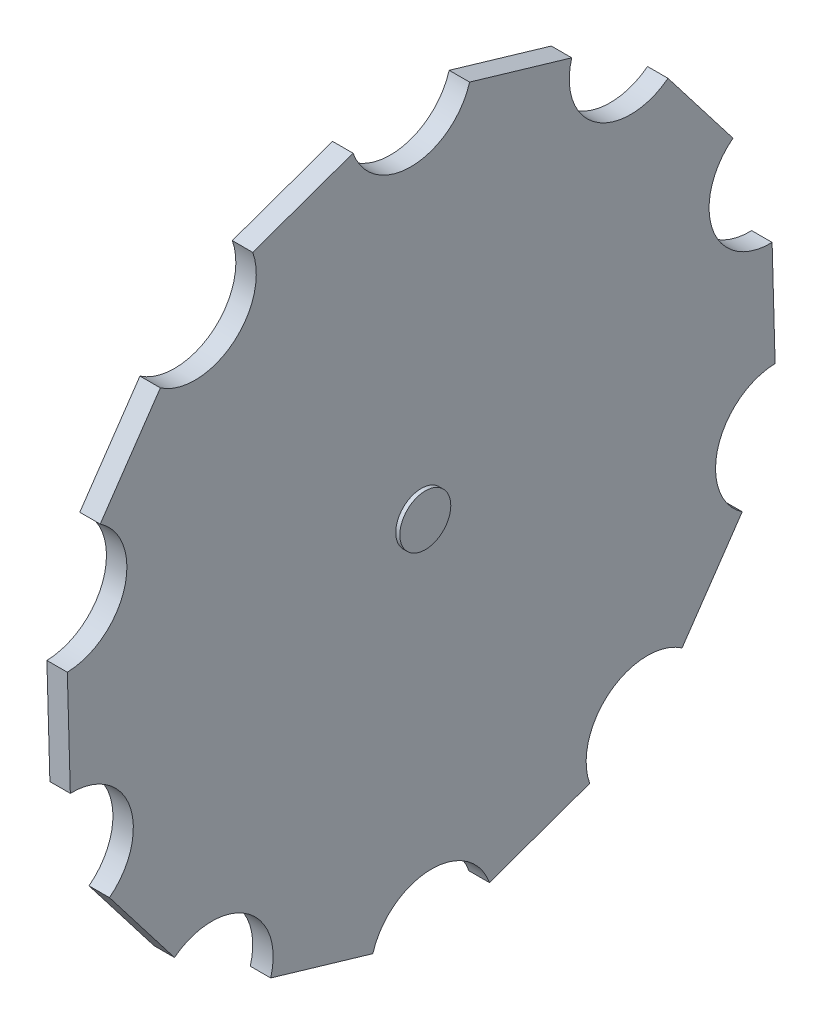
ISO-10303-21;
HEADER;
FILE_DESCRIPTION(('STEP AP214'),'2;1');
FILE_NAME('part.step','',(''),(''),'','','');
FILE_SCHEMA(('AUTOMOTIVE_DESIGN { 1 0 10303 214 1 1 1 1 }'));
ENDSEC;
DATA;
#1=APPLICATION_CONTEXT('core data for automotive mechanical design processes');
#2=APPLICATION_PROTOCOL_DEFINITION('international standard','automotive_design',2000,#1);
#3=PRODUCT_CONTEXT('',#1,'mechanical');
#4=PRODUCT('Part','Part','',(#3));
#5=PRODUCT_RELATED_PRODUCT_CATEGORY('part','',(#4));
#6=PRODUCT_DEFINITION_FORMATION('','',#4);
#7=PRODUCT_DEFINITION_CONTEXT('part definition',#1,'design');
#8=PRODUCT_DEFINITION('design','',#6,#7);
#9=PRODUCT_DEFINITION_SHAPE('','',#8);
#10=(LENGTH_UNIT() NAMED_UNIT(*) SI_UNIT(.MILLI.,.METRE.));
#11=(NAMED_UNIT(*) PLANE_ANGLE_UNIT() SI_UNIT($,.RADIAN.));
#12=(NAMED_UNIT(*) SI_UNIT($,.STERADIAN.) SOLID_ANGLE_UNIT());
#13=UNCERTAINTY_MEASURE_WITH_UNIT(LENGTH_MEASURE(1.E-05),#10,'distance_accuracy_value','');
#14=(GEOMETRIC_REPRESENTATION_CONTEXT(3) GLOBAL_UNCERTAINTY_ASSIGNED_CONTEXT((#13)) GLOBAL_UNIT_ASSIGNED_CONTEXT((#10,
#11,#12)) REPRESENTATION_CONTEXT('',''));
#15=CARTESIAN_POINT('',(0.,0.,0.));
#16=DIRECTION('',(0.,0.,1.));
#17=DIRECTION('',(1.,0.,0.));
#18=AXIS2_PLACEMENT_3D('',#15,#16,#17);
#19=CARTESIAN_POINT('',(5.,71.8468122282782,55.356705303896));
#20=DIRECTION('',(-1.,0.,0.));
#21=DIRECTION('',(0.,0.,1.));
#22=AXIS2_PLACEMENT_3D('',#19,#20,#21);
#23=CYLINDRICAL_SURFACE('',#22,14.9999999999995);
#24=CARTESIAN_POINT('',(0.,71.8468122282782,55.356705303896));
#25=DIRECTION('',(-1.,0.,0.));
#26=DIRECTION('',(0.,0.,-1.));
#27=AXIS2_PLACEMENT_3D('',#24,#25,#26);
#28=CIRCLE('',#27,14.9999999999995);
#29=CARTESIAN_POINT('',(0.,76.881944553864,41.2270399694369));
#30=VERTEX_POINT('',#29);
#31=CARTESIAN_POINT('',(0.,59.4680957045261,63.8282681599802));
#32=VERTEX_POINT('',#31);
#33=EDGE_CURVE('E244',#30,#32,#28,.T.);
#34=ORIENTED_EDGE('',*,*,#33,.T.);
#35=DIRECTION('',(-1.,0.,0.));
#36=VECTOR('',#35,1.);
#37=CARTESIAN_POINT('',(5.,59.4680957045261,63.8282681599802));
#38=LINE('',#37,#36);
#39=CARTESIAN_POINT('',(5.,59.4680957045261,63.8282681599802));
#40=VERTEX_POINT('',#39);
#41=EDGE_CURVE('E11',#40,#32,#38,.T.);
#42=ORIENTED_EDGE('',*,*,#41,.F.);
#43=CARTESIAN_POINT('',(5.,71.8468122282782,55.356705303896));
#44=DIRECTION('',(-1.,0.,0.));
#45=DIRECTION('',(0.,0.,-1.));
#46=AXIS2_PLACEMENT_3D('',#43,#44,#45);
#47=CIRCLE('',#46,14.9999999999995);
#48=CARTESIAN_POINT('',(5.,76.881944553864,41.2270399694369));
#49=VERTEX_POINT('',#48);
#50=EDGE_CURVE('E300',#49,#40,#47,.T.);
#51=ORIENTED_EDGE('',*,*,#50,.F.);
#52=DIRECTION('',(-1.,0.,0.));
#53=VECTOR('',#52,1.);
#54=CARTESIAN_POINT('',(5.,76.881944553864,41.2270399694369));
#55=LINE('',#54,#53);
#56=EDGE_CURVE('E240',#49,#30,#55,.T.);
#57=ORIENTED_EDGE('',*,*,#56,.T.);
#58=EDGE_LOOP('',(#34,#42,#51,#57));
#59=FACE_BOUND('',#58,.T.);
#60=ADVANCED_FACE('F47',(#59),#23,.F.);
#61=CARTESIAN_POINT('',(5.,59.4680957045261,63.8282681599802));
#62=DIRECTION('',(0.,-0.564770857072383,-0.825247768250073));
#63=DIRECTION('',(0.,0.825247768250073,-0.564770857072384));
#64=AXIS2_PLACEMENT_3D('',#61,#62,#63);
#65=PLANE('',#64);
#66=DIRECTION('',(0.,-0.825247768250073,0.564770857072383));
#67=VECTOR('',#66,1.);
#68=CARTESIAN_POINT('',(0.,59.4680957045261,63.8282681599802));
#69=LINE('',#68,#67);
#70=CARTESIAN_POINT('',(0.,37.9661536149617,78.5434491393781));
#71=VERTEX_POINT('',#70);
#72=EDGE_CURVE('E248',#32,#71,#69,.T.);
#73=ORIENTED_EDGE('',*,*,#72,.T.);
#74=DIRECTION('',(-1.,0.,0.));
#75=VECTOR('',#74,1.);
#76=CARTESIAN_POINT('',(5.,37.9661536149617,78.5434491393781));
#77=LINE('',#76,#75);
#78=CARTESIAN_POINT('',(5.,37.9661536149617,78.5434491393781));
#79=VERTEX_POINT('',#78);
#80=EDGE_CURVE('E55',#79,#71,#77,.T.);
#81=ORIENTED_EDGE('',*,*,#80,.F.);
#82=DIRECTION('',(0.,-0.825247768250073,0.564770857072383));
#83=VECTOR('',#82,1.);
#84=CARTESIAN_POINT('',(5.,59.4680957045261,63.8282681599802));
#85=LINE('',#84,#83);
#86=EDGE_CURVE('E157',#40,#79,#85,.T.);
#87=ORIENTED_EDGE('',*,*,#86,.F.);
#88=ORIENTED_EDGE('',*,*,#41,.T.);
#89=EDGE_LOOP('',(#73,#81,#87,#88));
#90=FACE_BOUND('',#89,.T.);
#91=ADVANCED_FACE('F442',(#90),#65,.F.);
#92=CARTESIAN_POINT('',(5.,25.5874370912123,87.0150119954661));
#93=DIRECTION('',(-1.,0.,0.));
#94=DIRECTION('',(0.,0.,1.));
#95=AXIS2_PLACEMENT_3D('',#92,#93,#94);
#96=CYLINDRICAL_SURFACE('',#95,14.9999999999999);
#97=CARTESIAN_POINT('',(0.,25.5874370912123,87.0150119954661));
#98=DIRECTION('',(-1.,0.,0.));
#99=DIRECTION('',(0.,0.,-1.));
#100=AXIS2_PLACEMENT_3D('',#97,#98,#99);
#101=CIRCLE('',#100,14.9999999999999);
#102=CARTESIAN_POINT('',(0.,10.5933853442723,86.5926232999832));
#103=VERTEX_POINT('',#102);
#104=EDGE_CURVE('E252',#71,#103,#101,.T.);
#105=ORIENTED_EDGE('',*,*,#104,.T.);
#106=DIRECTION('',(-1.,0.,0.));
#107=VECTOR('',#106,1.);
#108=CARTESIAN_POINT('',(5.,10.5933853442723,86.5926232999832));
#109=LINE('',#108,#107);
#110=CARTESIAN_POINT('',(5.,10.5933853442723,86.5926232999832));
#111=VERTEX_POINT('',#110);
#112=EDGE_CURVE('E353',#111,#103,#109,.T.);
#113=ORIENTED_EDGE('',*,*,#112,.F.);
#114=CARTESIAN_POINT('',(5.,25.5874370912123,87.0150119954661));
#115=DIRECTION('',(-1.,0.,0.));
#116=DIRECTION('',(0.,0.,-1.));
#117=AXIS2_PLACEMENT_3D('',#114,#115,#116);
#118=CIRCLE('',#117,14.9999999999999);
#119=EDGE_CURVE('E364',#79,#111,#118,.T.);
#120=ORIENTED_EDGE('',*,*,#119,.F.);
#121=ORIENTED_EDGE('',*,*,#80,.T.);
#122=EDGE_LOOP('',(#105,#113,#120,#121));
#123=FACE_BOUND('',#122,.T.);
#124=ADVANCED_FACE('F362',(#123),#96,.F.);
#125=CARTESIAN_POINT('',(5.,10.5933853442723,86.5926232999832));
#126=DIRECTION('',(0.,0.0281592463654012,-0.999603449796034));
#127=DIRECTION('',(0.,0.999603449796034,0.0281592463654012));
#128=AXIS2_PLACEMENT_3D('',#125,#126,#127);
#129=PLANE('',#128);
#130=DIRECTION('',(0.,-0.999603449796034,-0.0281592463654012));
#131=VECTOR('',#130,1.);
#132=CARTESIAN_POINT('',(0.,10.5933853442723,86.5926232999832));
#133=LINE('',#132,#131);
#134=CARTESIAN_POINT('',(0.,-15.4514175827556,85.8589303317265));
#135=VERTEX_POINT('',#134);
#136=EDGE_CURVE('E255',#103,#135,#133,.T.);
#137=ORIENTED_EDGE('',*,*,#136,.T.);
#138=DIRECTION('',(-1.,0.,0.));
#139=VECTOR('',#138,1.);
#140=CARTESIAN_POINT('',(5.,-15.4514175827556,85.8589303317265));
#141=LINE('',#140,#139);
#142=CARTESIAN_POINT('',(5.,-15.4514175827556,85.8589303317265));
#143=VERTEX_POINT('',#142);
#144=EDGE_CURVE('E349',#143,#135,#141,.T.);
#145=ORIENTED_EDGE('',*,*,#144,.F.);
#146=DIRECTION('',(0.,-0.999603449796034,-0.0281592463654012));
#147=VECTOR('',#146,1.);
#148=CARTESIAN_POINT('',(5.,10.5933853442723,86.5926232999832));
#149=LINE('',#148,#147);
#150=EDGE_CURVE('E383',#111,#143,#149,.T.);
#151=ORIENTED_EDGE('',*,*,#150,.F.);
#152=ORIENTED_EDGE('',*,*,#112,.T.);
#153=EDGE_LOOP('',(#137,#145,#151,#152));
#154=FACE_BOUND('',#153,.T.);
#155=ADVANCED_FACE('F373',(#154),#129,.F.);
#156=CARTESIAN_POINT('',(5.,-30.445469329697,85.436541636248));
#157=DIRECTION('',(-1.,0.,0.));
#158=DIRECTION('',(0.,0.,1.));
#159=AXIS2_PLACEMENT_3D('',#156,#157,#158);
#160=CYLINDRICAL_SURFACE('',#159,15.0000000000007);
#161=CARTESIAN_POINT('',(0.,-30.445469329697,85.436541636248));
#162=DIRECTION('',(-1.,0.,0.));
#163=DIRECTION('',(0.,0.,-1.));
#164=AXIS2_PLACEMENT_3D('',#161,#162,#163);
#165=CIRCLE('',#164,15.0000000000007);
#166=CARTESIAN_POINT('',(0.,-42.3276381615703,76.2815395144077));
#167=VERTEX_POINT('',#166);
#168=EDGE_CURVE('E258',#135,#167,#165,.T.);
#169=ORIENTED_EDGE('',*,*,#168,.T.);
#170=DIRECTION('',(-1.,0.,0.));
#171=VECTOR('',#170,1.);
#172=CARTESIAN_POINT('',(5.,-42.3276381615703,76.2815395144077));
#173=LINE('',#172,#171);
#174=CARTESIAN_POINT('',(5.,-42.3276381615703,76.2815395144077));
#175=VERTEX_POINT('',#174);
#176=EDGE_CURVE('E345',#175,#167,#173,.T.);
#177=ORIENTED_EDGE('',*,*,#176,.F.);
#178=CARTESIAN_POINT('',(5.,-30.445469329697,85.436541636248));
#179=DIRECTION('',(-1.,0.,0.));
#180=DIRECTION('',(0.,0.,-1.));
#181=AXIS2_PLACEMENT_3D('',#178,#179,#180);
#182=CIRCLE('',#181,15.0000000000007);
#183=EDGE_CURVE('E379',#143,#175,#182,.T.);
#184=ORIENTED_EDGE('',*,*,#183,.F.);
#185=ORIENTED_EDGE('',*,*,#144,.T.);
#186=EDGE_LOOP('',(#169,#177,#184,#185));
#187=FACE_BOUND('',#186,.T.);
#188=ADVANCED_FACE('F377',(#187),#160,.F.);
#189=CARTESIAN_POINT('',(5.,-42.3276381615703,76.2815395144077));
#190=DIRECTION('',(0.,0.610333474789187,-0.792144588791564));
#191=DIRECTION('',(0.,0.792144588791564,0.610333474789187));
#192=AXIS2_PLACEMENT_3D('',#189,#190,#191);
#193=PLANE('',#192);
#194=DIRECTION('',(0.,-0.792144588791564,-0.610333474789187));
#195=VECTOR('',#194,1.);
#196=CARTESIAN_POINT('',(0.,-42.3276381615703,76.2815395144077));
#197=LINE('',#196,#195);
#198=CARTESIAN_POINT('',(0.,-62.9670724382288,60.379218375065));
#199=VERTEX_POINT('',#198);
#200=EDGE_CURVE('E261',#167,#199,#197,.T.);
#201=ORIENTED_EDGE('',*,*,#200,.T.);
#202=DIRECTION('',(-1.,0.,0.));
#203=VECTOR('',#202,1.);
#204=CARTESIAN_POINT('',(5.,-62.9670724382288,60.379218375065));
#205=LINE('',#204,#203);
#206=CARTESIAN_POINT('',(5.,-62.9670724382288,60.379218375065));
#207=VERTEX_POINT('',#206);
#208=EDGE_CURVE('E341',#207,#199,#205,.T.);
#209=ORIENTED_EDGE('',*,*,#208,.F.);
#210=DIRECTION('',(0.,-0.792144588791564,-0.610333474789187));
#211=VECTOR('',#210,1.);
#212=CARTESIAN_POINT('',(5.,-42.3276381615703,76.2815395144077));
#213=LINE('',#212,#211);
#214=EDGE_CURVE('E382',#175,#207,#213,.T.);
#215=ORIENTED_EDGE('',*,*,#214,.F.);
#216=ORIENTED_EDGE('',*,*,#176,.T.);
#217=EDGE_LOOP('',(#201,#209,#215,#216));
#218=FACE_BOUND('',#217,.T.);
#219=ADVANCED_FACE('F455',(#218),#193,.F.);
#220=CARTESIAN_POINT('',(5.,-74.8492412701045,51.2242162532287));
#221=DIRECTION('',(-1.,0.,0.));
#222=DIRECTION('',(0.,0.,1.));
#223=AXIS2_PLACEMENT_3D('',#220,#221,#222);
#224=CYLINDRICAL_SURFACE('',#223,15.0000000000007);
#225=CARTESIAN_POINT('',(0.,-74.8492412701045,51.2242162532287));
#226=DIRECTION('',(-1.,0.,0.));
#227=DIRECTION('',(0.,0.,-1.));
#228=AXIS2_PLACEMENT_3D('',#225,#226,#227);
#229=CIRCLE('',#228,15.0000000000007);
#230=CARTESIAN_POINT('',(0.,-79.0809425531984,36.8335003484966));
#231=VERTEX_POINT('',#230);
#232=EDGE_CURVE('E264',#199,#231,#229,.T.);
#233=ORIENTED_EDGE('',*,*,#232,.T.);
#234=DIRECTION('',(-1.,0.,0.));
#235=VECTOR('',#234,1.);
#236=CARTESIAN_POINT('',(5.,-79.0809425531984,36.8335003484966));
#237=LINE('',#236,#235);
#238=CARTESIAN_POINT('',(5.,-79.0809425531984,36.8335003484966));
#239=VERTEX_POINT('',#238);
#240=EDGE_CURVE('E338',#239,#231,#237,.T.);
#241=ORIENTED_EDGE('',*,*,#240,.F.);
#242=CARTESIAN_POINT('',(5.,-74.8492412701045,51.2242162532287));
#243=DIRECTION('',(-1.,0.,0.));
#244=DIRECTION('',(0.,0.,-1.));
#245=AXIS2_PLACEMENT_3D('',#242,#243,#244);
#246=CIRCLE('',#245,15.0000000000007);
#247=EDGE_CURVE('E386',#207,#239,#246,.T.);
#248=ORIENTED_EDGE('',*,*,#247,.F.);
#249=ORIENTED_EDGE('',*,*,#208,.T.);
#250=EDGE_LOOP('',(#233,#241,#248,#249));
#251=FACE_BOUND('',#250,.T.);
#252=ADVANCED_FACE('F458',(#251),#224,.F.);
#253=CARTESIAN_POINT('',(5.,-79.0809425531984,36.8335003484966));
#254=DIRECTION('',(0.,0.959381060315333,-0.282113418873025));
#255=DIRECTION('',(0.,0.282113418873025,0.959381060315333));
#256=AXIS2_PLACEMENT_3D('',#253,#254,#255);
#257=PLANE('',#256);
#258=DIRECTION('',(0.,-0.282113418873025,-0.959381060315333));
#259=VECTOR('',#258,1.);
#260=CARTESIAN_POINT('',(0.,-79.0809425531984,36.8335003484966));
#261=LINE('',#260,#259);
#262=CARTESIAN_POINT('',(0.,-86.4314457943753,11.8366972132809));
#263=VERTEX_POINT('',#262);
#264=EDGE_CURVE('E267',#231,#263,#261,.T.);
#265=ORIENTED_EDGE('',*,*,#264,.T.);
#266=DIRECTION('',(-1.,0.,0.));
#267=VECTOR('',#266,1.);
#268=CARTESIAN_POINT('',(5.,-86.4314457943753,11.8366972132809));
#269=LINE('',#268,#267);
#270=CARTESIAN_POINT('',(5.,-86.4314457943753,11.8366972132809));
#271=VERTEX_POINT('',#270);
#272=EDGE_CURVE('E334',#271,#263,#269,.T.);
#273=ORIENTED_EDGE('',*,*,#272,.F.);
#274=DIRECTION('',(0.,-0.282113418873025,-0.959381060315333));
#275=VECTOR('',#274,1.);
#276=CARTESIAN_POINT('',(5.,-79.0809425531984,36.8335003484966));
#277=LINE('',#276,#275);
#278=EDGE_CURVE('E394',#239,#271,#277,.T.);
#279=ORIENTED_EDGE('',*,*,#278,.F.);
#280=ORIENTED_EDGE('',*,*,#240,.T.);
#281=EDGE_LOOP('',(#265,#273,#279,#280));
#282=FACE_BOUND('',#281,.T.);
#283=ADVANCED_FACE('F462',(#282),#257,.F.);
#284=CARTESIAN_POINT('',(5.,-90.6631470774734,-2.55401869144907));
#285=DIRECTION('',(-1.,0.,0.));
#286=DIRECTION('',(0.,0.,1.));
#287=AXIS2_PLACEMENT_3D('',#284,#285,#286);
#288=CYLINDRICAL_SURFACE('',#287,15.0000000000007);
#289=CARTESIAN_POINT('',(0.,-90.6631470774734,-2.55401869144907));
#290=DIRECTION('',(-1.,0.,0.));
#291=DIRECTION('',(0.,0.,-1.));
#292=AXIS2_PLACEMENT_3D('',#289,#290,#291);
#293=CIRCLE('',#292,15.0000000000007);
#294=CARTESIAN_POINT('',(0.,-85.6280147518824,-16.6836840259091));
#295=VERTEX_POINT('',#294);
#296=EDGE_CURVE('E270',#263,#295,#293,.T.);
#297=ORIENTED_EDGE('',*,*,#296,.T.);
#298=DIRECTION('',(-1.,0.,0.));
#299=VECTOR('',#298,1.);
#300=CARTESIAN_POINT('',(5.,-85.6280147518824,-16.6836840259091));
#301=LINE('',#300,#299);
#302=CARTESIAN_POINT('',(5.,-85.6280147518824,-16.6836840259091));
#303=VERTEX_POINT('',#302);
#304=EDGE_CURVE('E330',#303,#295,#301,.T.);
#305=ORIENTED_EDGE('',*,*,#304,.F.);
#306=CARTESIAN_POINT('',(5.,-90.6631470774734,-2.55401869144907));
#307=DIRECTION('',(-1.,0.,0.));
#308=DIRECTION('',(0.,0.,-1.));
#309=AXIS2_PLACEMENT_3D('',#306,#307,#308);
#310=CIRCLE('',#309,15.0000000000007);
#311=EDGE_CURVE('E397',#271,#303,#310,.T.);
#312=ORIENTED_EDGE('',*,*,#311,.F.);
#313=ORIENTED_EDGE('',*,*,#272,.T.);
#314=EDGE_LOOP('',(#297,#305,#312,#313));
#315=FACE_BOUND('',#314,.T.);
#316=ADVANCED_FACE('F465',(#315),#288,.F.);
#317=CARTESIAN_POINT('',(5.,-85.6280147518824,-16.6836840259091));
#318=DIRECTION('',(0.,0.941977688963934,0.335675488372574));
#319=DIRECTION('',(0.,-0.335675488372575,0.941977688963934));
#320=AXIS2_PLACEMENT_3D('',#317,#318,#319);
#321=PLANE('',#320);
#322=DIRECTION('',(0.,0.335675488372574,-0.941977688963934));
#323=VECTOR('',#322,1.);
#324=CARTESIAN_POINT('',(0.,-85.6280147518824,-16.6836840259091));
#325=LINE('',#324,#323);
#326=CARTESIAN_POINT('',(0.,-76.8819445538643,-41.2270399694364));
#327=VERTEX_POINT('',#326);
#328=EDGE_CURVE('E273',#295,#327,#325,.T.);
#329=ORIENTED_EDGE('',*,*,#328,.T.);
#330=DIRECTION('',(-1.,0.,0.));
#331=VECTOR('',#330,1.);
#332=CARTESIAN_POINT('',(5.,-76.8819445538643,-41.2270399694364));
#333=LINE('',#332,#331);
#334=CARTESIAN_POINT('',(5.,-76.8819445538643,-41.2270399694364));
#335=VERTEX_POINT('',#334);
#336=EDGE_CURVE('E326',#335,#327,#333,.T.);
#337=ORIENTED_EDGE('',*,*,#336,.F.);
#338=DIRECTION('',(0.,0.335675488372574,-0.941977688963934));
#339=VECTOR('',#338,1.);
#340=CARTESIAN_POINT('',(5.,-85.6280147518824,-16.6836840259091));
#341=LINE('',#340,#339);
#342=EDGE_CURVE('E400',#303,#335,#341,.T.);
#343=ORIENTED_EDGE('',*,*,#342,.F.);
#344=ORIENTED_EDGE('',*,*,#304,.T.);
#345=EDGE_LOOP('',(#329,#337,#343,#344));
#346=FACE_BOUND('',#345,.T.);
#347=ADVANCED_FACE('F469',(#346),#321,.F.);
#348=CARTESIAN_POINT('',(5.,-71.8468122282782,-55.3567053038959));
#349=DIRECTION('',(-1.,0.,0.));
#350=DIRECTION('',(0.,0.,1.));
#351=AXIS2_PLACEMENT_3D('',#348,#349,#350);
#352=CYLINDRICAL_SURFACE('',#351,14.9999999999995);
#353=CARTESIAN_POINT('',(0.,-71.8468122282782,-55.3567053038959));
#354=DIRECTION('',(-1.,0.,0.));
#355=DIRECTION('',(0.,0.,-1.));
#356=AXIS2_PLACEMENT_3D('',#353,#354,#355);
#357=CIRCLE('',#356,14.9999999999995);
#358=CARTESIAN_POINT('',(0.,-59.4680957045265,-63.8282681599798));
#359=VERTEX_POINT('',#358);
#360=EDGE_CURVE('E276',#327,#359,#357,.T.);
#361=ORIENTED_EDGE('',*,*,#360,.T.);
#362=DIRECTION('',(-1.,0.,0.));
#363=VECTOR('',#362,1.);
#364=CARTESIAN_POINT('',(5.,-59.4680957045265,-63.8282681599798));
#365=LINE('',#364,#363);
#366=CARTESIAN_POINT('',(5.,-59.4680957045265,-63.8282681599798));
#367=VERTEX_POINT('',#366);
#368=EDGE_CURVE('E322',#367,#359,#365,.T.);
#369=ORIENTED_EDGE('',*,*,#368,.F.);
#370=CARTESIAN_POINT('',(5.,-71.8468122282782,-55.3567053038959));
#371=DIRECTION('',(-1.,0.,0.));
#372=DIRECTION('',(0.,0.,-1.));
#373=AXIS2_PLACEMENT_3D('',#370,#371,#372);
#374=CIRCLE('',#373,14.9999999999995);
#375=EDGE_CURVE('E403',#335,#367,#374,.T.);
#376=ORIENTED_EDGE('',*,*,#375,.F.);
#377=ORIENTED_EDGE('',*,*,#336,.T.);
#378=EDGE_LOOP('',(#361,#369,#376,#377));
#379=FACE_BOUND('',#378,.T.);
#380=ADVANCED_FACE('F473',(#379),#352,.F.);
#381=CARTESIAN_POINT('',(5.,-59.4680957045265,-63.8282681599798));
#382=DIRECTION('',(0.,0.564770857072388,0.82524776825007));
#383=DIRECTION('',(0.,-0.82524776825007,0.564770857072388));
#384=AXIS2_PLACEMENT_3D('',#381,#382,#383);
#385=PLANE('',#384);
#386=DIRECTION('',(0.,0.82524776825007,-0.564770857072388));
#387=VECTOR('',#386,1.);
#388=CARTESIAN_POINT('',(0.,-59.4680957045265,-63.8282681599798));
#389=LINE('',#388,#387);
#390=CARTESIAN_POINT('',(0.,-37.9661536149615,-78.5434491393783));
#391=VERTEX_POINT('',#390);
#392=EDGE_CURVE('E279',#359,#391,#389,.T.);
#393=ORIENTED_EDGE('',*,*,#392,.T.);
#394=DIRECTION('',(-1.,0.,0.));
#395=VECTOR('',#394,1.);
#396=CARTESIAN_POINT('',(5.,-37.9661536149615,-78.5434491393783));
#397=LINE('',#396,#395);
#398=CARTESIAN_POINT('',(5.,-37.9661536149615,-78.5434491393783));
#399=VERTEX_POINT('',#398);
#400=EDGE_CURVE('E319',#399,#391,#397,.T.);
#401=ORIENTED_EDGE('',*,*,#400,.F.);
#402=DIRECTION('',(0.,0.82524776825007,-0.564770857072388));
#403=VECTOR('',#402,1.);
#404=CARTESIAN_POINT('',(5.,-59.4680957045265,-63.8282681599798));
#405=LINE('',#404,#403);
#406=EDGE_CURVE('E406',#367,#399,#405,.T.);
#407=ORIENTED_EDGE('',*,*,#406,.F.);
#408=ORIENTED_EDGE('',*,*,#368,.T.);
#409=EDGE_LOOP('',(#393,#401,#407,#408));
#410=FACE_BOUND('',#409,.T.);
#411=ADVANCED_FACE('F476',(#410),#385,.F.);
#412=CARTESIAN_POINT('',(5.,-25.5874370912123,-87.015011995466));
#413=DIRECTION('',(-1.,0.,0.));
#414=DIRECTION('',(0.,0.,1.));
#415=AXIS2_PLACEMENT_3D('',#412,#413,#414);
#416=CYLINDRICAL_SURFACE('',#415,14.9999999999995);
#417=CARTESIAN_POINT('',(0.,-25.5874370912123,-87.015011995466));
#418=DIRECTION('',(-1.,0.,0.));
#419=DIRECTION('',(0.,0.,-1.));
#420=AXIS2_PLACEMENT_3D('',#417,#418,#419);
#421=CIRCLE('',#420,14.9999999999995);
#422=CARTESIAN_POINT('',(0.,-10.5933853442724,-86.5926232999831));
#423=VERTEX_POINT('',#422);
#424=EDGE_CURVE('E282',#391,#423,#421,.T.);
#425=ORIENTED_EDGE('',*,*,#424,.T.);
#426=DIRECTION('',(-1.,0.,0.));
#427=VECTOR('',#426,1.);
#428=CARTESIAN_POINT('',(5.,-10.5933853442724,-86.5926232999831));
#429=LINE('',#428,#427);
#430=CARTESIAN_POINT('',(5.,-10.5933853442724,-86.5926232999831));
#431=VERTEX_POINT('',#430);
#432=EDGE_CURVE('E316',#431,#423,#429,.T.);
#433=ORIENTED_EDGE('',*,*,#432,.F.);
#434=CARTESIAN_POINT('',(5.,-25.5874370912123,-87.015011995466));
#435=DIRECTION('',(-1.,0.,0.));
#436=DIRECTION('',(0.,0.,-1.));
#437=AXIS2_PLACEMENT_3D('',#434,#435,#436);
#438=CIRCLE('',#437,14.9999999999995);
#439=EDGE_CURVE('E409',#399,#431,#438,.T.);
#440=ORIENTED_EDGE('',*,*,#439,.F.);
#441=ORIENTED_EDGE('',*,*,#400,.T.);
#442=EDGE_LOOP('',(#425,#433,#440,#441));
#443=FACE_BOUND('',#442,.T.);
#444=ADVANCED_FACE('F480',(#443),#416,.F.);
#445=CARTESIAN_POINT('',(5.,-10.5933853442724,-86.5926232999831));
#446=DIRECTION('',(0.,-0.0281592463654,0.999603449796034));
#447=DIRECTION('',(0.,-0.999603449796034,-0.0281592463654));
#448=AXIS2_PLACEMENT_3D('',#445,#446,#447);
#449=PLANE('',#448);
#450=DIRECTION('',(0.,0.999603449796034,0.0281592463653999));
#451=VECTOR('',#450,1.);
#452=CARTESIAN_POINT('',(0.,-10.5933853442724,-86.5926232999831));
#453=LINE('',#452,#451);
#454=CARTESIAN_POINT('',(0.,15.4514175827569,-85.8589303317263));
#455=VERTEX_POINT('',#454);
#456=EDGE_CURVE('E285',#423,#455,#453,.T.);
#457=ORIENTED_EDGE('',*,*,#456,.T.);
#458=DIRECTION('',(-1.,0.,0.));
#459=VECTOR('',#458,1.);
#460=CARTESIAN_POINT('',(5.,15.4514175827569,-85.8589303317263));
#461=LINE('',#460,#459);
#462=CARTESIAN_POINT('',(5.,15.4514175827569,-85.8589303317263));
#463=VERTEX_POINT('',#462);
#464=EDGE_CURVE('E313',#463,#455,#461,.T.);
#465=ORIENTED_EDGE('',*,*,#464,.F.);
#466=DIRECTION('',(0.,0.999603449796034,0.0281592463653999));
#467=VECTOR('',#466,1.);
#468=CARTESIAN_POINT('',(5.,-10.5933853442724,-86.5926232999831));
#469=LINE('',#468,#467);
#470=EDGE_CURVE('E411',#431,#463,#469,.T.);
#471=ORIENTED_EDGE('',*,*,#470,.F.);
#472=ORIENTED_EDGE('',*,*,#432,.T.);
#473=EDGE_LOOP('',(#457,#465,#471,#472));
#474=FACE_BOUND('',#473,.T.);
#475=ADVANCED_FACE('F484',(#474),#449,.F.);
#476=CARTESIAN_POINT('',(5.,30.4454693296969,-85.4365416362479));
#477=DIRECTION('',(-1.,0.,0.));
#478=DIRECTION('',(0.,0.,1.));
#479=AXIS2_PLACEMENT_3D('',#476,#477,#478);
#480=CYLINDRICAL_SURFACE('',#479,14.9999999999994);
#481=CARTESIAN_POINT('',(0.,30.4454693296969,-85.4365416362479));
#482=DIRECTION('',(-1.,0.,0.));
#483=DIRECTION('',(0.,0.,-1.));
#484=AXIS2_PLACEMENT_3D('',#481,#482,#483);
#485=CIRCLE('',#484,14.9999999999994);
#486=CARTESIAN_POINT('',(0.,42.3276381615688,-76.2815395144089));
#487=VERTEX_POINT('',#486);
#488=EDGE_CURVE('E287',#455,#487,#485,.T.);
#489=ORIENTED_EDGE('',*,*,#488,.T.);
#490=DIRECTION('',(-1.,0.,0.));
#491=VECTOR('',#490,1.);
#492=CARTESIAN_POINT('',(5.,42.3276381615688,-76.2815395144089));
#493=LINE('',#492,#491);
#494=CARTESIAN_POINT('',(5.,42.3276381615688,-76.2815395144089));
#495=VERTEX_POINT('',#494);
#496=EDGE_CURVE('E310',#495,#487,#493,.T.);
#497=ORIENTED_EDGE('',*,*,#496,.F.);
#498=CARTESIAN_POINT('',(5.,30.4454693296969,-85.4365416362479));
#499=DIRECTION('',(-1.,0.,0.));
#500=DIRECTION('',(0.,0.,-1.));
#501=AXIS2_PLACEMENT_3D('',#498,#499,#500);
#502=CIRCLE('',#501,14.9999999999994);
#503=EDGE_CURVE('E413',#463,#495,#502,.T.);
#504=ORIENTED_EDGE('',*,*,#503,.F.);
#505=ORIENTED_EDGE('',*,*,#464,.T.);
#506=EDGE_LOOP('',(#489,#497,#504,#505));
#507=FACE_BOUND('',#506,.T.);
#508=ADVANCED_FACE('F488',(#507),#480,.F.);
#509=CARTESIAN_POINT('',(5.,42.3276381615688,-76.2815395144089));
#510=DIRECTION('',(0.,-0.610333474789189,0.792144588791563));
#511=DIRECTION('',(0.,-0.792144588791563,-0.610333474789189));
#512=AXIS2_PLACEMENT_3D('',#509,#510,#511);
#513=PLANE('',#512);
#514=DIRECTION('',(0.,0.792144588791563,0.610333474789189));
#515=VECTOR('',#514,1.);
#516=CARTESIAN_POINT('',(0.,42.3276381615688,-76.2815395144089));
#517=LINE('',#516,#515);
#518=CARTESIAN_POINT('',(0.,62.9670724382299,-60.3792183750641));
#519=VERTEX_POINT('',#518);
#520=EDGE_CURVE('E289',#487,#519,#517,.T.);
#521=ORIENTED_EDGE('',*,*,#520,.T.);
#522=DIRECTION('',(-1.,0.,0.));
#523=VECTOR('',#522,1.);
#524=CARTESIAN_POINT('',(5.,62.9670724382299,-60.3792183750641));
#525=LINE('',#524,#523);
#526=CARTESIAN_POINT('',(5.,62.9670724382299,-60.3792183750641));
#527=VERTEX_POINT('',#526);
#528=EDGE_CURVE('E307',#527,#519,#525,.T.);
#529=ORIENTED_EDGE('',*,*,#528,.F.);
#530=DIRECTION('',(0.,0.792144588791563,0.610333474789189));
#531=VECTOR('',#530,1.);
#532=CARTESIAN_POINT('',(5.,42.3276381615688,-76.2815395144089));
#533=LINE('',#532,#531);
#534=EDGE_CURVE('E415',#495,#527,#533,.T.);
#535=ORIENTED_EDGE('',*,*,#534,.F.);
#536=ORIENTED_EDGE('',*,*,#496,.T.);
#537=EDGE_LOOP('',(#521,#529,#535,#536));
#538=FACE_BOUND('',#537,.T.);
#539=ADVANCED_FACE('F421',(#538),#513,.F.);
#540=CARTESIAN_POINT('',(5.,74.8492412701044,-51.2242162532287));
#541=DIRECTION('',(-1.,0.,0.));
#542=DIRECTION('',(0.,0.,1.));
#543=AXIS2_PLACEMENT_3D('',#540,#541,#542);
#544=CYLINDRICAL_SURFACE('',#543,14.9999999999994);
#545=CARTESIAN_POINT('',(0.,74.8492412701044,-51.2242162532287));
#546=DIRECTION('',(-1.,0.,0.));
#547=DIRECTION('',(0.,0.,-1.));
#548=AXIS2_PLACEMENT_3D('',#545,#546,#547);
#549=CIRCLE('',#548,14.9999999999994);
#550=CARTESIAN_POINT('',(0.,79.0809425531978,-36.8335003484986));
#551=VERTEX_POINT('',#550);
#552=EDGE_CURVE('E291',#519,#551,#549,.T.);
#553=ORIENTED_EDGE('',*,*,#552,.T.);
#554=DIRECTION('',(-1.,0.,0.));
#555=VECTOR('',#554,1.);
#556=CARTESIAN_POINT('',(5.,79.0809425531978,-36.8335003484986));
#557=LINE('',#556,#555);
#558=CARTESIAN_POINT('',(5.,79.0809425531978,-36.8335003484986));
#559=VERTEX_POINT('',#558);
#560=EDGE_CURVE('E231',#559,#551,#557,.T.);
#561=ORIENTED_EDGE('',*,*,#560,.F.);
#562=CARTESIAN_POINT('',(5.,74.8492412701044,-51.2242162532287));
#563=DIRECTION('',(-1.,0.,0.));
#564=DIRECTION('',(0.,0.,-1.));
#565=AXIS2_PLACEMENT_3D('',#562,#563,#564);
#566=CIRCLE('',#565,14.9999999999994);
#567=EDGE_CURVE('E222',#527,#559,#566,.T.);
#568=ORIENTED_EDGE('',*,*,#567,.F.);
#569=ORIENTED_EDGE('',*,*,#528,.T.);
#570=EDGE_LOOP('',(#553,#561,#568,#569));
#571=FACE_BOUND('',#570,.T.);
#572=ADVANCED_FACE('F425',(#571),#544,.F.);
#573=CARTESIAN_POINT('',(5.,79.0809425531978,-36.8335003484986));
#574=DIRECTION('',(0.,-0.959381060315334,0.282113418873022));
#575=DIRECTION('',(0.,-0.282113418873022,-0.959381060315334));
#576=AXIS2_PLACEMENT_3D('',#573,#574,#575);
#577=PLANE('',#576);
#578=DIRECTION('',(0.,0.282113418873022,0.959381060315334));
#579=VECTOR('',#578,1.);
#580=CARTESIAN_POINT('',(0.,79.0809425531978,-36.8335003484986));
#581=LINE('',#580,#579);
#582=CARTESIAN_POINT('',(0.,86.4314457943757,-11.8366972132795));
#583=VERTEX_POINT('',#582);
#584=EDGE_CURVE('E230',#551,#583,#581,.T.);
#585=ORIENTED_EDGE('',*,*,#584,.T.);
#586=DIRECTION('',(-1.,0.,0.));
#587=VECTOR('',#586,1.);
#588=CARTESIAN_POINT('',(5.,86.4314457943757,-11.8366972132795));
#589=LINE('',#588,#587);
#590=CARTESIAN_POINT('',(5.,86.4314457943757,-11.8366972132795));
#591=VERTEX_POINT('',#590);
#592=EDGE_CURVE('E227',#591,#583,#589,.T.);
#593=ORIENTED_EDGE('',*,*,#592,.F.);
#594=DIRECTION('',(0.,0.282113418873022,0.959381060315334));
#595=VECTOR('',#594,1.);
#596=CARTESIAN_POINT('',(5.,79.0809425531978,-36.8335003484986));
#597=LINE('',#596,#595);
#598=EDGE_CURVE('E216',#559,#591,#597,.T.);
#599=ORIENTED_EDGE('',*,*,#598,.F.);
#600=ORIENTED_EDGE('',*,*,#560,.T.);
#601=EDGE_LOOP('',(#585,#593,#599,#600));
#602=FACE_BOUND('',#601,.T.);
#603=ADVANCED_FACE('F228',(#602),#577,.F.);
#604=CARTESIAN_POINT('',(5.,90.6631470774734,2.55401869144917));
#605=DIRECTION('',(-1.,0.,0.));
#606=DIRECTION('',(0.,0.,1.));
#607=AXIS2_PLACEMENT_3D('',#604,#605,#606);
#608=CYLINDRICAL_SURFACE('',#607,14.9999999999993);
#609=CARTESIAN_POINT('',(0.,90.6631470774734,2.55401869144917));
#610=DIRECTION('',(-1.,0.,0.));
#611=DIRECTION('',(0.,0.,-1.));
#612=AXIS2_PLACEMENT_3D('',#609,#610,#611);
#613=CIRCLE('',#612,14.9999999999993);
#614=CARTESIAN_POINT('',(0.,85.6280147518831,16.6836840259071));
#615=VERTEX_POINT('',#614);
#616=EDGE_CURVE('E143',#583,#615,#613,.T.);
#617=ORIENTED_EDGE('',*,*,#616,.T.);
#618=DIRECTION('',(-1.,0.,0.));
#619=VECTOR('',#618,1.);
#620=CARTESIAN_POINT('',(5.,85.6280147518831,16.6836840259071));
#621=LINE('',#620,#619);
#622=CARTESIAN_POINT('',(5.,85.6280147518831,16.6836840259071));
#623=VERTEX_POINT('',#622);
#624=EDGE_CURVE('E232',#623,#615,#621,.T.);
#625=ORIENTED_EDGE('',*,*,#624,.F.);
#626=CARTESIAN_POINT('',(5.,90.6631470774734,2.55401869144917));
#627=DIRECTION('',(-1.,0.,0.));
#628=DIRECTION('',(0.,0.,-1.));
#629=AXIS2_PLACEMENT_3D('',#626,#627,#628);
#630=CIRCLE('',#629,14.9999999999993);
#631=EDGE_CURVE('E220',#591,#623,#630,.T.);
#632=ORIENTED_EDGE('',*,*,#631,.F.);
#633=ORIENTED_EDGE('',*,*,#592,.T.);
#634=EDGE_LOOP('',(#617,#625,#632,#633));
#635=FACE_BOUND('',#634,.T.);
#636=ADVANCED_FACE('F234',(#635),#608,.F.);
#637=CARTESIAN_POINT('',(5.,85.6280147518831,16.6836840259071));
#638=DIRECTION('',(0.,-0.941977688963932,-0.335675488372578));
#639=DIRECTION('',(0.,0.335675488372578,-0.941977688963933));
#640=AXIS2_PLACEMENT_3D('',#637,#638,#639);
#641=PLANE('',#640);
#642=DIRECTION('',(0.,-0.335675488372578,0.941977688963932));
#643=VECTOR('',#642,1.);
#644=CARTESIAN_POINT('',(0.,85.6280147518831,16.6836840259071));
#645=LINE('',#644,#643);
#646=EDGE_CURVE('E149',#615,#30,#645,.T.);
#647=ORIENTED_EDGE('',*,*,#646,.T.);
#648=ORIENTED_EDGE('',*,*,#56,.F.);
#649=DIRECTION('',(0.,-0.335675488372578,0.941977688963932));
#650=VECTOR('',#649,1.);
#651=CARTESIAN_POINT('',(5.,85.6280147518831,16.6836840259071));
#652=LINE('',#651,#650);
#653=EDGE_CURVE('E66',#623,#49,#652,.T.);
#654=ORIENTED_EDGE('',*,*,#653,.F.);
#655=ORIENTED_EDGE('',*,*,#624,.T.);
#656=EDGE_LOOP('',(#647,#648,#654,#655));
#657=FACE_BOUND('',#656,.T.);
#658=ADVANCED_FACE('F429',(#657),#641,.F.);
#659=CARTESIAN_POINT('',(5.,71.8468122282782,55.356705303896));
#660=DIRECTION('',(1.,0.,0.));
#661=DIRECTION('',(0.,0.,-1.));
#662=AXIS2_PLACEMENT_3D('',#659,#660,#661);
#663=PLANE('',#662);
#664=CARTESIAN_POINT('',(5.,0.,0.));
#665=DIRECTION('',(1.,0.,0.));
#666=DIRECTION('',(0.,0.,-1.));
#667=AXIS2_PLACEMENT_3D('',#664,#665,#666);
#668=CIRCLE('',#667,6.23594990279239);
#669=CARTESIAN_POINT('',(5.,0.,-6.23594990279239));
#670=VERTEX_POINT('',#669);
#671=EDGE_CURVE('E656',#670,#670,#668,.T.);
#672=ORIENTED_EDGE('',*,*,#671,.F.);
#673=EDGE_LOOP('',(#672));
#674=FACE_BOUND('',#673,.T.);
#675=ORIENTED_EDGE('',*,*,#50,.T.);
#676=ORIENTED_EDGE('',*,*,#86,.T.);
#677=ORIENTED_EDGE('',*,*,#119,.T.);
#678=ORIENTED_EDGE('',*,*,#150,.T.);
#679=ORIENTED_EDGE('',*,*,#183,.T.);
#680=ORIENTED_EDGE('',*,*,#214,.T.);
#681=ORIENTED_EDGE('',*,*,#247,.T.);
#682=ORIENTED_EDGE('',*,*,#278,.T.);
#683=ORIENTED_EDGE('',*,*,#311,.T.);
#684=ORIENTED_EDGE('',*,*,#342,.T.);
#685=ORIENTED_EDGE('',*,*,#375,.T.);
#686=ORIENTED_EDGE('',*,*,#406,.T.);
#687=ORIENTED_EDGE('',*,*,#439,.T.);
#688=ORIENTED_EDGE('',*,*,#470,.T.);
#689=ORIENTED_EDGE('',*,*,#503,.T.);
#690=ORIENTED_EDGE('',*,*,#534,.T.);
#691=ORIENTED_EDGE('',*,*,#567,.T.);
#692=ORIENTED_EDGE('',*,*,#598,.T.);
#693=ORIENTED_EDGE('',*,*,#631,.T.);
#694=ORIENTED_EDGE('',*,*,#653,.T.);
#695=EDGE_LOOP('',(#675,#676,#677,#678,#679,#680,#681,#682,#683,#684,#685,#686,#687,#688,#689,
#690,#691,#692,#693,#694));
#696=FACE_BOUND('',#695,.T.);
#697=ADVANCED_FACE('F218',(#674,#696),#663,.T.);
#698=CARTESIAN_POINT('',(0.,71.8468122282782,55.356705303896));
#699=DIRECTION('',(1.,0.,0.));
#700=DIRECTION('',(0.,0.,-1.));
#701=AXIS2_PLACEMENT_3D('',#698,#699,#700);
#702=PLANE('',#701);
#703=ORIENTED_EDGE('',*,*,#33,.F.);
#704=ORIENTED_EDGE('',*,*,#646,.F.);
#705=ORIENTED_EDGE('',*,*,#616,.F.);
#706=ORIENTED_EDGE('',*,*,#584,.F.);
#707=ORIENTED_EDGE('',*,*,#552,.F.);
#708=ORIENTED_EDGE('',*,*,#520,.F.);
#709=ORIENTED_EDGE('',*,*,#488,.F.);
#710=ORIENTED_EDGE('',*,*,#456,.F.);
#711=ORIENTED_EDGE('',*,*,#424,.F.);
#712=ORIENTED_EDGE('',*,*,#392,.F.);
#713=ORIENTED_EDGE('',*,*,#360,.F.);
#714=ORIENTED_EDGE('',*,*,#328,.F.);
#715=ORIENTED_EDGE('',*,*,#296,.F.);
#716=ORIENTED_EDGE('',*,*,#264,.F.);
#717=ORIENTED_EDGE('',*,*,#232,.F.);
#718=ORIENTED_EDGE('',*,*,#200,.F.);
#719=ORIENTED_EDGE('',*,*,#168,.F.);
#720=ORIENTED_EDGE('',*,*,#136,.F.);
#721=ORIENTED_EDGE('',*,*,#104,.F.);
#722=ORIENTED_EDGE('',*,*,#72,.F.);
#723=EDGE_LOOP('',(#703,#704,#705,#706,#707,#708,#709,#710,#711,#712,#713,#714,#715,#716,#717,
#718,#719,#720,#721,#722));
#724=FACE_BOUND('',#723,.T.);
#725=ADVANCED_FACE('F368',(#724),#702,.F.);
#726=CARTESIAN_POINT('',(6.,0.,0.));
#727=DIRECTION('',(-1.,0.,0.));
#728=DIRECTION('',(0.,0.,1.));
#729=AXIS2_PLACEMENT_3D('',#726,#727,#728);
#730=CYLINDRICAL_SURFACE('',#729,6.23594990279239);
#731=CARTESIAN_POINT('',(6.,0.,0.));
#732=DIRECTION('',(1.,0.,0.));
#733=DIRECTION('',(0.,0.,-1.));
#734=AXIS2_PLACEMENT_3D('',#731,#732,#733);
#735=CIRCLE('',#734,6.23594990279239);
#736=CARTESIAN_POINT('',(6.,0.,-6.23594990279239));
#737=VERTEX_POINT('',#736);
#738=EDGE_CURVE('E249',#737,#737,#735,.T.);
#739=ORIENTED_EDGE('',*,*,#738,.F.);
#740=EDGE_LOOP('',(#739));
#741=FACE_BOUND('',#740,.T.);
#742=ORIENTED_EDGE('',*,*,#671,.T.);
#743=EDGE_LOOP('',(#742));
#744=FACE_BOUND('',#743,.T.);
#745=ADVANCED_FACE('F520',(#741,#744),#730,.T.);
#746=CARTESIAN_POINT('',(6.,0.,0.));
#747=DIRECTION('',(1.,0.,0.));
#748=DIRECTION('',(0.,0.,-1.));
#749=AXIS2_PLACEMENT_3D('',#746,#747,#748);
#750=PLANE('',#749);
#751=ORIENTED_EDGE('',*,*,#738,.T.);
#752=EDGE_LOOP('',(#751));
#753=FACE_BOUND('',#752,.T.);
#754=ADVANCED_FACE('F532',(#753),#750,.T.);
#755=CLOSED_SHELL('',(#60,#91,#124,#155,#188,#219,#252,#283,#316,#347,#380,#411,#444,#475,#508,
#539,#572,#603,#636,#658,#697,#725,#745,#754));
#756=MANIFOLD_SOLID_BREP('B2',#755);
#757=ADVANCED_BREP_SHAPE_REPRESENTATION('',(#18,#756),#14);
#758=SHAPE_DEFINITION_REPRESENTATION(#9,#757);
ENDSEC;
END-ISO-10303-21;
